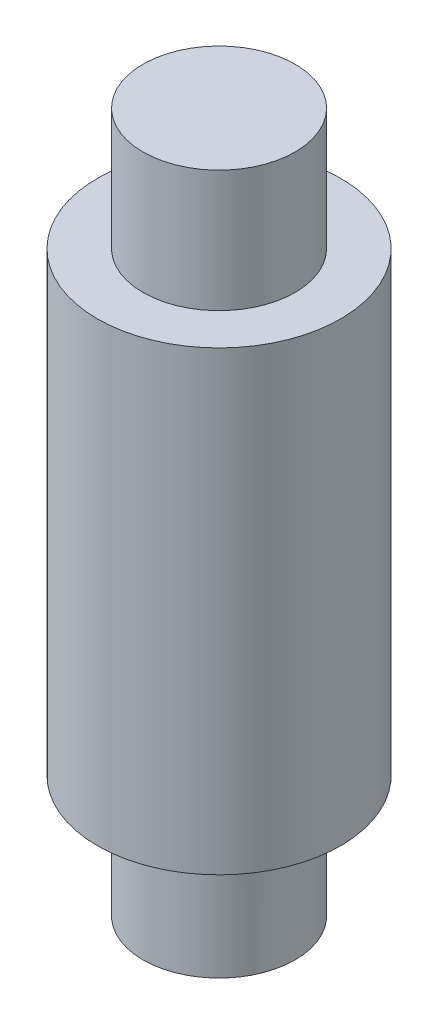
ISO-10303-21;
HEADER;
FILE_DESCRIPTION(('STEP AP214'),'2;1');
FILE_NAME('part.step','',(''),(''),'','','');
FILE_SCHEMA(('AUTOMOTIVE_DESIGN { 1 0 10303 214 1 1 1 1 }'));
ENDSEC;
DATA;
#1=APPLICATION_CONTEXT('core data for automotive mechanical design processes');
#2=APPLICATION_PROTOCOL_DEFINITION('international standard','automotive_design',2000,#1);
#3=PRODUCT_CONTEXT('',#1,'mechanical');
#4=PRODUCT('Part','Part','',(#3));
#5=PRODUCT_RELATED_PRODUCT_CATEGORY('part','',(#4));
#6=PRODUCT_DEFINITION_FORMATION('','',#4);
#7=PRODUCT_DEFINITION_CONTEXT('part definition',#1,'design');
#8=PRODUCT_DEFINITION('design','',#6,#7);
#9=PRODUCT_DEFINITION_SHAPE('','',#8);
#10=(LENGTH_UNIT() NAMED_UNIT(*) SI_UNIT(.MILLI.,.METRE.));
#11=(NAMED_UNIT(*) PLANE_ANGLE_UNIT() SI_UNIT($,.RADIAN.));
#12=(NAMED_UNIT(*) SI_UNIT($,.STERADIAN.) SOLID_ANGLE_UNIT());
#13=UNCERTAINTY_MEASURE_WITH_UNIT(LENGTH_MEASURE(1.E-05),#10,'distance_accuracy_value','');
#14=(GEOMETRIC_REPRESENTATION_CONTEXT(3) GLOBAL_UNCERTAINTY_ASSIGNED_CONTEXT((#13)) GLOBAL_UNIT_ASSIGNED_CONTEXT((#10,
#11,#12)) REPRESENTATION_CONTEXT('',''));
#15=CARTESIAN_POINT('',(0.,0.,0.));
#16=DIRECTION('',(0.,0.,1.));
#17=DIRECTION('',(1.,0.,0.));
#18=AXIS2_PLACEMENT_3D('',#15,#16,#17);
#19=CARTESIAN_POINT('',(0.,15.,0.));
#20=DIRECTION('',(0.,-1.,0.));
#21=DIRECTION('',(0.,0.,-1.));
#22=AXIS2_PLACEMENT_3D('',#19,#20,#21);
#23=CYLINDRICAL_SURFACE('',#22,4.);
#24=CARTESIAN_POINT('',(0.,15.,0.));
#25=DIRECTION('',(0.,1.,0.));
#26=DIRECTION('',(0.,0.,1.));
#27=AXIS2_PLACEMENT_3D('',#24,#25,#26);
#28=CIRCLE('',#27,4.);
#29=CARTESIAN_POINT('',(0.,15.,4.));
#30=VERTEX_POINT('',#29);
#31=EDGE_CURVE('E39',#30,#30,#28,.T.);
#32=ORIENTED_EDGE('',*,*,#31,.F.);
#33=EDGE_LOOP('',(#32));
#34=FACE_BOUND('',#33,.T.);
#35=CARTESIAN_POINT('',(0.,0.,0.));
#36=DIRECTION('',(0.,1.,0.));
#37=DIRECTION('',(0.,0.,1.));
#38=AXIS2_PLACEMENT_3D('',#35,#36,#37);
#39=CIRCLE('',#38,4.);
#40=CARTESIAN_POINT('',(0.,0.,4.));
#41=VERTEX_POINT('',#40);
#42=EDGE_CURVE('E43',#41,#41,#39,.T.);
#43=ORIENTED_EDGE('',*,*,#42,.T.);
#44=EDGE_LOOP('',(#43));
#45=FACE_BOUND('',#44,.T.);
#46=ADVANCED_FACE('F33',(#34,#45),#23,.T.);
#47=CARTESIAN_POINT('',(0.,15.,0.));
#48=DIRECTION('',(0.,1.,0.));
#49=DIRECTION('',(0.,0.,1.));
#50=AXIS2_PLACEMENT_3D('',#47,#48,#49);
#51=PLANE('',#50);
#52=CARTESIAN_POINT('',(0.,15.,0.));
#53=DIRECTION('',(0.,1.,0.));
#54=DIRECTION('',(0.,0.,1.));
#55=AXIS2_PLACEMENT_3D('',#52,#53,#54);
#56=CIRCLE('',#55,2.5);
#57=CARTESIAN_POINT('',(0.,15.,2.5));
#58=VERTEX_POINT('',#57);
#59=EDGE_CURVE('E50',#58,#58,#56,.T.);
#60=ORIENTED_EDGE('',*,*,#59,.F.);
#61=EDGE_LOOP('',(#60));
#62=FACE_BOUND('',#61,.T.);
#63=ORIENTED_EDGE('',*,*,#31,.T.);
#64=EDGE_LOOP('',(#63));
#65=FACE_BOUND('',#64,.T.);
#66=ADVANCED_FACE('F74',(#62,#65),#51,.T.);
#67=CARTESIAN_POINT('',(0.,0.,0.));
#68=DIRECTION('',(0.,1.,0.));
#69=DIRECTION('',(0.,0.,1.));
#70=AXIS2_PLACEMENT_3D('',#67,#68,#69);
#71=PLANE('',#70);
#72=CARTESIAN_POINT('',(0.,0.,0.));
#73=DIRECTION('',(0.,1.,0.));
#74=DIRECTION('',(0.,0.,1.));
#75=AXIS2_PLACEMENT_3D('',#72,#73,#74);
#76=CIRCLE('',#75,2.5);
#77=CARTESIAN_POINT('',(0.,0.,2.5));
#78=VERTEX_POINT('',#77);
#79=EDGE_CURVE('E10',#78,#78,#76,.F.);
#80=ORIENTED_EDGE('',*,*,#79,.F.);
#81=EDGE_LOOP('',(#80));
#82=FACE_BOUND('',#81,.T.);
#83=ORIENTED_EDGE('',*,*,#42,.F.);
#84=EDGE_LOOP('',(#83));
#85=FACE_BOUND('',#84,.T.);
#86=ADVANCED_FACE('F79',(#82,#85),#71,.F.);
#87=CARTESIAN_POINT('',(0.,19.,0.));
#88=DIRECTION('',(0.,-1.,0.));
#89=DIRECTION('',(0.,0.,-1.));
#90=AXIS2_PLACEMENT_3D('',#87,#88,#89);
#91=CYLINDRICAL_SURFACE('',#90,2.5);
#92=CARTESIAN_POINT('',(0.,19.,0.));
#93=DIRECTION('',(0.,1.,0.));
#94=DIRECTION('',(0.,0.,1.));
#95=AXIS2_PLACEMENT_3D('',#92,#93,#94);
#96=CIRCLE('',#95,2.5);
#97=CARTESIAN_POINT('',(0.,19.,2.5));
#98=VERTEX_POINT('',#97);
#99=EDGE_CURVE('E48',#98,#98,#96,.T.);
#100=ORIENTED_EDGE('',*,*,#99,.F.);
#101=EDGE_LOOP('',(#100));
#102=FACE_BOUND('',#101,.T.);
#103=ORIENTED_EDGE('',*,*,#59,.T.);
#104=EDGE_LOOP('',(#103));
#105=FACE_BOUND('',#104,.T.);
#106=ADVANCED_FACE('F70',(#102,#105),#91,.T.);
#107=CARTESIAN_POINT('',(0.,19.,0.));
#108=DIRECTION('',(0.,1.,0.));
#109=DIRECTION('',(0.,0.,1.));
#110=AXIS2_PLACEMENT_3D('',#107,#108,#109);
#111=PLANE('',#110);
#112=ORIENTED_EDGE('',*,*,#99,.T.);
#113=EDGE_LOOP('',(#112));
#114=FACE_BOUND('',#113,.T.);
#115=ADVANCED_FACE('F63',(#114),#111,.T.);
#116=CARTESIAN_POINT('',(0.,-4.,0.));
#117=DIRECTION('',(0.,1.,0.));
#118=DIRECTION('',(0.,0.,1.));
#119=AXIS2_PLACEMENT_3D('',#116,#117,#118);
#120=CYLINDRICAL_SURFACE('',#119,2.5);
#121=CARTESIAN_POINT('',(0.,-4.,0.));
#122=DIRECTION('',(0.,-1.,0.));
#123=DIRECTION('',(0.,0.,-1.));
#124=AXIS2_PLACEMENT_3D('',#121,#122,#123);
#125=CIRCLE('',#124,2.5);
#126=CARTESIAN_POINT('',(0.,-4.,-2.5));
#127=VERTEX_POINT('',#126);
#128=EDGE_CURVE('E53',#127,#127,#125,.T.);
#129=ORIENTED_EDGE('',*,*,#128,.F.);
#130=EDGE_LOOP('',(#129));
#131=FACE_BOUND('',#130,.T.);
#132=ORIENTED_EDGE('',*,*,#79,.T.);
#133=EDGE_LOOP('',(#132));
#134=FACE_BOUND('',#133,.T.);
#135=ADVANCED_FACE('F61',(#131,#134),#120,.T.);
#136=CARTESIAN_POINT('',(0.,-4.,0.));
#137=DIRECTION('',(0.,-1.,0.));
#138=DIRECTION('',(0.,0.,-1.));
#139=AXIS2_PLACEMENT_3D('',#136,#137,#138);
#140=PLANE('',#139);
#141=ORIENTED_EDGE('',*,*,#128,.T.);
#142=EDGE_LOOP('',(#141));
#143=FACE_BOUND('',#142,.T.);
#144=ADVANCED_FACE('F59',(#143),#140,.T.);
#145=CLOSED_SHELL('',(#46,#66,#86,#106,#115,#135,#144));
#146=MANIFOLD_SOLID_BREP('B2',#145);
#147=ADVANCED_BREP_SHAPE_REPRESENTATION('',(#18,#146),#14);
#148=SHAPE_DEFINITION_REPRESENTATION(#9,#147);
ENDSEC;
END-ISO-10303-21;
